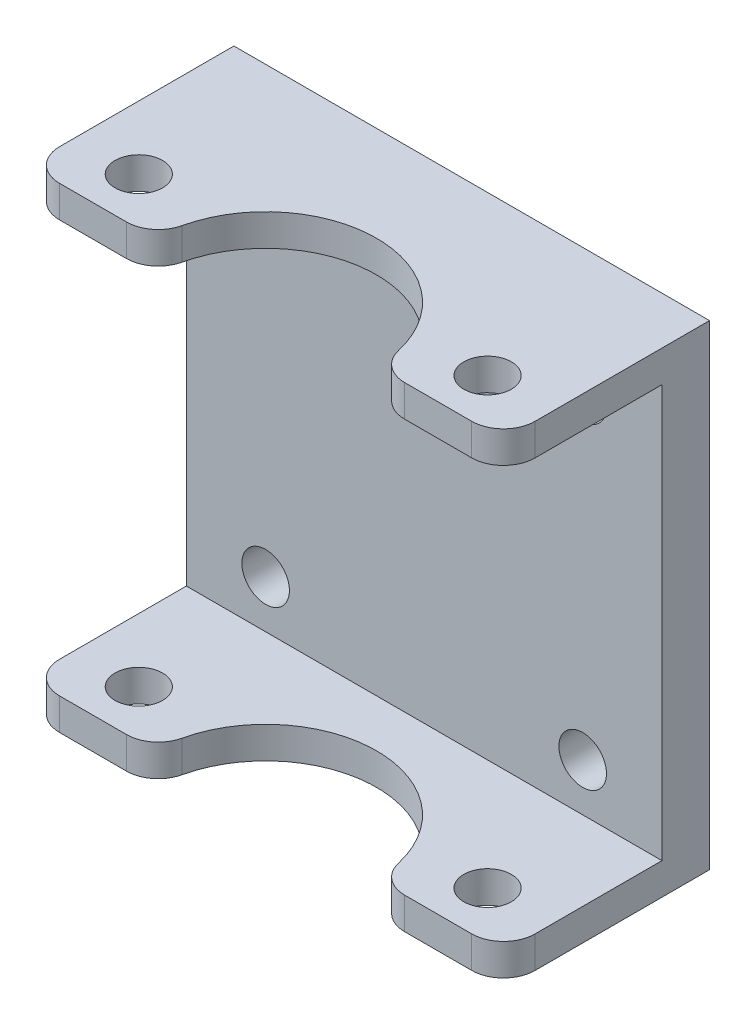
ISO-10303-21;
HEADER;
FILE_DESCRIPTION(('STEP AP214'),'2;1');
FILE_NAME('part.step','',(''),(''),'','','');
FILE_SCHEMA(('AUTOMOTIVE_DESIGN { 1 0 10303 214 1 1 1 1 }'));
ENDSEC;
DATA;
#1=APPLICATION_CONTEXT('core data for automotive mechanical design processes');
#2=APPLICATION_PROTOCOL_DEFINITION('international standard','automotive_design',2000,#1);
#3=PRODUCT_CONTEXT('',#1,'mechanical');
#4=PRODUCT('Part','Part','',(#3));
#5=PRODUCT_RELATED_PRODUCT_CATEGORY('part','',(#4));
#6=PRODUCT_DEFINITION_FORMATION('','',#4);
#7=PRODUCT_DEFINITION_CONTEXT('part definition',#1,'design');
#8=PRODUCT_DEFINITION('design','',#6,#7);
#9=PRODUCT_DEFINITION_SHAPE('','',#8);
#10=(LENGTH_UNIT() NAMED_UNIT(*) SI_UNIT(.MILLI.,.METRE.));
#11=(NAMED_UNIT(*) PLANE_ANGLE_UNIT() SI_UNIT($,.RADIAN.));
#12=(NAMED_UNIT(*) SI_UNIT($,.STERADIAN.) SOLID_ANGLE_UNIT());
#13=UNCERTAINTY_MEASURE_WITH_UNIT(LENGTH_MEASURE(1.E-05),#10,'distance_accuracy_value','');
#14=(GEOMETRIC_REPRESENTATION_CONTEXT(3) GLOBAL_UNCERTAINTY_ASSIGNED_CONTEXT((#13)) GLOBAL_UNIT_ASSIGNED_CONTEXT((#10,
#11,#12)) REPRESENTATION_CONTEXT('',''));
#15=CARTESIAN_POINT('',(0.,0.,0.));
#16=DIRECTION('',(0.,0.,1.));
#17=DIRECTION('',(1.,0.,0.));
#18=AXIS2_PLACEMENT_3D('',#15,#16,#17);
#19=CARTESIAN_POINT('',(0.,0.,3.));
#20=DIRECTION('',(0.,0.,1.));
#21=DIRECTION('',(1.,0.,0.));
#22=AXIS2_PLACEMENT_3D('',#19,#20,#21);
#23=PLANE('',#22);
#24=CARTESIAN_POINT('',(-10.,-9.99999999999999,3.));
#25=DIRECTION('',(0.,0.,1.));
#26=DIRECTION('',(1.,0.,0.));
#27=AXIS2_PLACEMENT_3D('',#24,#25,#26);
#28=CIRCLE('',#27,1.5);
#29=CARTESIAN_POINT('',(-8.5,-9.99999999999999,3.));
#30=VERTEX_POINT('',#29);
#31=EDGE_CURVE('E227',#30,#30,#28,.T.);
#32=ORIENTED_EDGE('',*,*,#31,.F.);
#33=EDGE_LOOP('',(#32));
#34=FACE_BOUND('',#33,.T.);
#35=CARTESIAN_POINT('',(-10.,10.,3.));
#36=DIRECTION('',(0.,0.,1.));
#37=DIRECTION('',(1.,0.,0.));
#38=AXIS2_PLACEMENT_3D('',#35,#36,#37);
#39=CIRCLE('',#38,1.5);
#40=CARTESIAN_POINT('',(-8.5,10.,3.));
#41=VERTEX_POINT('',#40);
#42=EDGE_CURVE('E243',#41,#41,#39,.T.);
#43=ORIENTED_EDGE('',*,*,#42,.F.);
#44=EDGE_LOOP('',(#43));
#45=FACE_BOUND('',#44,.T.);
#46=CARTESIAN_POINT('',(9.99999999999999,10.,3.));
#47=DIRECTION('',(0.,0.,1.));
#48=DIRECTION('',(1.,0.,0.));
#49=AXIS2_PLACEMENT_3D('',#46,#47,#48);
#50=CIRCLE('',#49,1.5);
#51=CARTESIAN_POINT('',(11.5,10.,3.));
#52=VERTEX_POINT('',#51);
#53=EDGE_CURVE('E235',#52,#52,#50,.T.);
#54=ORIENTED_EDGE('',*,*,#53,.F.);
#55=EDGE_LOOP('',(#54));
#56=FACE_BOUND('',#55,.T.);
#57=CARTESIAN_POINT('',(10.,-9.99999999999999,3.));
#58=DIRECTION('',(0.,0.,1.));
#59=DIRECTION('',(1.,0.,0.));
#60=AXIS2_PLACEMENT_3D('',#57,#58,#59);
#61=CIRCLE('',#60,1.5);
#62=CARTESIAN_POINT('',(11.5,-9.99999999999999,3.));
#63=VERTEX_POINT('',#62);
#64=EDGE_CURVE('E219',#63,#63,#61,.T.);
#65=ORIENTED_EDGE('',*,*,#64,.F.);
#66=EDGE_LOOP('',(#65));
#67=FACE_BOUND('',#66,.T.);
#68=DIRECTION('',(0.,-1.,0.));
#69=VECTOR('',#68,1.);
#70=CARTESIAN_POINT('',(-15.,15.,3.));
#71=LINE('',#70,#69);
#72=CARTESIAN_POINT('',(-15.,13.,3.));
#73=VERTEX_POINT('',#72);
#74=CARTESIAN_POINT('',(-15.,-13.,3.));
#75=VERTEX_POINT('',#74);
#76=EDGE_CURVE('E203',#73,#75,#71,.T.);
#77=ORIENTED_EDGE('',*,*,#76,.T.);
#78=DIRECTION('',(-1.,0.,0.));
#79=VECTOR('',#78,1.);
#80=CARTESIAN_POINT('',(-15.,-13.,3.));
#81=LINE('',#80,#79);
#82=CARTESIAN_POINT('',(15.,-13.,3.));
#83=VERTEX_POINT('',#82);
#84=EDGE_CURVE('E201',#83,#75,#81,.T.);
#85=ORIENTED_EDGE('',*,*,#84,.F.);
#86=DIRECTION('',(0.,1.,0.));
#87=VECTOR('',#86,1.);
#88=CARTESIAN_POINT('',(15.,15.,3.));
#89=LINE('',#88,#87);
#90=CARTESIAN_POINT('',(15.,13.,3.));
#91=VERTEX_POINT('',#90);
#92=EDGE_CURVE('E185',#83,#91,#89,.T.);
#93=ORIENTED_EDGE('',*,*,#92,.T.);
#94=DIRECTION('',(1.,0.,0.));
#95=VECTOR('',#94,1.);
#96=CARTESIAN_POINT('',(-15.,13.,3.));
#97=LINE('',#96,#95);
#98=EDGE_CURVE('E193',#73,#91,#97,.T.);
#99=ORIENTED_EDGE('',*,*,#98,.F.);
#100=EDGE_LOOP('',(#77,#85,#93,#99));
#101=FACE_BOUND('',#100,.T.);
#102=ADVANCED_FACE('F41',(#34,#45,#56,#67,#101),#23,.T.);
#103=CARTESIAN_POINT('',(0.,0.,0.));
#104=DIRECTION('',(0.,0.,1.));
#105=DIRECTION('',(1.,0.,0.));
#106=AXIS2_PLACEMENT_3D('',#103,#104,#105);
#107=PLANE('',#106);
#108=DIRECTION('',(0.,1.,0.));
#109=VECTOR('',#108,1.);
#110=CARTESIAN_POINT('',(15.,15.,0.));
#111=LINE('',#110,#109);
#112=CARTESIAN_POINT('',(15.,-15.,0.));
#113=VERTEX_POINT('',#112);
#114=CARTESIAN_POINT('',(15.,15.,0.));
#115=VERTEX_POINT('',#114);
#116=EDGE_CURVE('E247',#113,#115,#111,.T.);
#117=ORIENTED_EDGE('',*,*,#116,.F.);
#118=DIRECTION('',(1.,0.,0.));
#119=VECTOR('',#118,1.);
#120=CARTESIAN_POINT('',(-15.,-15.,0.));
#121=LINE('',#120,#119);
#122=CARTESIAN_POINT('',(-15.,-15.,0.));
#123=VERTEX_POINT('',#122);
#124=EDGE_CURVE('E204',#123,#113,#121,.T.);
#125=ORIENTED_EDGE('',*,*,#124,.F.);
#126=DIRECTION('',(0.,-1.,0.));
#127=VECTOR('',#126,1.);
#128=CARTESIAN_POINT('',(-15.,15.,0.));
#129=LINE('',#128,#127);
#130=CARTESIAN_POINT('',(-15.,15.,0.));
#131=VERTEX_POINT('',#130);
#132=EDGE_CURVE('E261',#131,#123,#129,.T.);
#133=ORIENTED_EDGE('',*,*,#132,.F.);
#134=DIRECTION('',(-1.,0.,0.));
#135=VECTOR('',#134,1.);
#136=CARTESIAN_POINT('',(-15.,15.,0.));
#137=LINE('',#136,#135);
#138=EDGE_CURVE('E257',#115,#131,#137,.T.);
#139=ORIENTED_EDGE('',*,*,#138,.F.);
#140=EDGE_LOOP('',(#117,#125,#133,#139));
#141=FACE_BOUND('',#140,.T.);
#142=CARTESIAN_POINT('',(-10.,10.,0.));
#143=DIRECTION('',(0.,0.,1.));
#144=DIRECTION('',(1.,0.,0.));
#145=AXIS2_PLACEMENT_3D('',#142,#143,#144);
#146=CIRCLE('',#145,1.5);
#147=CARTESIAN_POINT('',(-8.5,10.,0.));
#148=VERTEX_POINT('',#147);
#149=EDGE_CURVE('E239',#148,#148,#146,.T.);
#150=ORIENTED_EDGE('',*,*,#149,.T.);
#151=EDGE_LOOP('',(#150));
#152=FACE_BOUND('',#151,.T.);
#153=CARTESIAN_POINT('',(9.99999999999999,10.,0.));
#154=DIRECTION('',(0.,0.,1.));
#155=DIRECTION('',(1.,0.,0.));
#156=AXIS2_PLACEMENT_3D('',#153,#154,#155);
#157=CIRCLE('',#156,1.5);
#158=CARTESIAN_POINT('',(11.5,10.,0.));
#159=VERTEX_POINT('',#158);
#160=EDGE_CURVE('E231',#159,#159,#157,.T.);
#161=ORIENTED_EDGE('',*,*,#160,.T.);
#162=EDGE_LOOP('',(#161));
#163=FACE_BOUND('',#162,.T.);
#164=CARTESIAN_POINT('',(-10.,-9.99999999999999,0.));
#165=DIRECTION('',(0.,0.,1.));
#166=DIRECTION('',(1.,0.,0.));
#167=AXIS2_PLACEMENT_3D('',#164,#165,#166);
#168=CIRCLE('',#167,1.5);
#169=CARTESIAN_POINT('',(-8.5,-9.99999999999999,0.));
#170=VERTEX_POINT('',#169);
#171=EDGE_CURVE('E223',#170,#170,#168,.T.);
#172=ORIENTED_EDGE('',*,*,#171,.T.);
#173=EDGE_LOOP('',(#172));
#174=FACE_BOUND('',#173,.T.);
#175=CARTESIAN_POINT('',(10.,-9.99999999999999,0.));
#176=DIRECTION('',(0.,0.,1.));
#177=DIRECTION('',(1.,0.,0.));
#178=AXIS2_PLACEMENT_3D('',#175,#176,#177);
#179=CIRCLE('',#178,1.5);
#180=CARTESIAN_POINT('',(11.5,-9.99999999999999,0.));
#181=VERTEX_POINT('',#180);
#182=EDGE_CURVE('E218',#181,#181,#179,.T.);
#183=ORIENTED_EDGE('',*,*,#182,.T.);
#184=EDGE_LOOP('',(#183));
#185=FACE_BOUND('',#184,.T.);
#186=ADVANCED_FACE('F492',(#141,#152,#163,#174,#185),#107,.F.);
#187=CARTESIAN_POINT('',(15.,15.,3.));
#188=DIRECTION('',(-1.,0.,0.));
#189=DIRECTION('',(0.,-1.,0.));
#190=AXIS2_PLACEMENT_3D('',#187,#188,#189);
#191=PLANE('',#190);
#192=DIRECTION('',(0.,0.,-1.));
#193=VECTOR('',#192,1.);
#194=CARTESIAN_POINT('',(15.,-13.,21.));
#195=LINE('',#194,#193);
#196=CARTESIAN_POINT('',(15.,-13.,11.));
#197=VERTEX_POINT('',#196);
#198=EDGE_CURVE('E209',#197,#83,#195,.T.);
#199=ORIENTED_EDGE('',*,*,#198,.F.);
#200=DIRECTION('',(0.,-1.,0.));
#201=VECTOR('',#200,1.);
#202=CARTESIAN_POINT('',(15.,15.,11.));
#203=LINE('',#202,#201);
#204=CARTESIAN_POINT('',(15.,-15.,11.));
#205=VERTEX_POINT('',#204);
#206=EDGE_CURVE('E342',#197,#205,#203,.T.);
#207=ORIENTED_EDGE('',*,*,#206,.T.);
#208=DIRECTION('',(0.,0.,-1.));
#209=VECTOR('',#208,1.);
#210=CARTESIAN_POINT('',(15.,-15.,3.));
#211=LINE('',#210,#209);
#212=EDGE_CURVE('E253',#205,#113,#211,.T.);
#213=ORIENTED_EDGE('',*,*,#212,.T.);
#214=ORIENTED_EDGE('',*,*,#116,.T.);
#215=DIRECTION('',(0.,0.,-1.));
#216=VECTOR('',#215,1.);
#217=CARTESIAN_POINT('',(15.,15.,3.));
#218=LINE('',#217,#216);
#219=CARTESIAN_POINT('',(15.,15.,11.));
#220=VERTEX_POINT('',#219);
#221=EDGE_CURVE('E276',#220,#115,#218,.T.);
#222=ORIENTED_EDGE('',*,*,#221,.F.);
#223=DIRECTION('',(0.,-1.,0.));
#224=VECTOR('',#223,1.);
#225=CARTESIAN_POINT('',(15.,15.,11.));
#226=LINE('',#225,#224);
#227=CARTESIAN_POINT('',(15.,13.,11.));
#228=VERTEX_POINT('',#227);
#229=EDGE_CURVE('E188',#220,#228,#226,.T.);
#230=ORIENTED_EDGE('',*,*,#229,.T.);
#231=DIRECTION('',(0.,0.,-1.));
#232=VECTOR('',#231,1.);
#233=CARTESIAN_POINT('',(15.,13.,21.));
#234=LINE('',#233,#232);
#235=EDGE_CURVE('E181',#228,#91,#234,.T.);
#236=ORIENTED_EDGE('',*,*,#235,.T.);
#237=ORIENTED_EDGE('',*,*,#92,.F.);
#238=EDGE_LOOP('',(#199,#207,#213,#214,#222,#230,#236,#237));
#239=FACE_BOUND('',#238,.T.);
#240=ADVANCED_FACE('F184',(#239),#191,.F.);
#241=CARTESIAN_POINT('',(-15.,15.,3.));
#242=DIRECTION('',(0.,-1.,0.));
#243=DIRECTION('',(0.,0.,-1.));
#244=AXIS2_PLACEMENT_3D('',#241,#242,#243);
#245=PLANE('',#244);
#246=CARTESIAN_POINT('',(-11.,15.,10.));
#247=DIRECTION('',(0.,-1.,0.));
#248=DIRECTION('',(1.,0.,0.));
#249=AXIS2_PLACEMENT_3D('',#246,#247,#248);
#250=CIRCLE('',#249,1.5);
#251=CARTESIAN_POINT('',(-9.5,15.,10.));
#252=VERTEX_POINT('',#251);
#253=EDGE_CURVE('E285',#252,#252,#250,.T.);
#254=ORIENTED_EDGE('',*,*,#253,.T.);
#255=EDGE_LOOP('',(#254));
#256=FACE_BOUND('',#255,.T.);
#257=CARTESIAN_POINT('',(11.,15.,10.));
#258=DIRECTION('',(0.,-1.,0.));
#259=DIRECTION('',(-1.,0.,0.));
#260=AXIS2_PLACEMENT_3D('',#257,#258,#259);
#261=CIRCLE('',#260,1.5);
#262=CARTESIAN_POINT('',(9.5,15.,10.));
#263=VERTEX_POINT('',#262);
#264=EDGE_CURVE('E431',#263,#263,#261,.T.);
#265=ORIENTED_EDGE('',*,*,#264,.T.);
#266=EDGE_LOOP('',(#265));
#267=FACE_BOUND('',#266,.T.);
#268=DIRECTION('',(1.,0.,0.));
#269=VECTOR('',#268,1.);
#270=CARTESIAN_POINT('',(16.365937277099,15.,13.));
#271=LINE('',#270,#269);
#272=CARTESIAN_POINT('',(8.77496438739212,15.,13.));
#273=VERTEX_POINT('',#272);
#274=CARTESIAN_POINT('',(13.,15.,13.));
#275=VERTEX_POINT('',#274);
#276=EDGE_CURVE('E468',#273,#275,#271,.T.);
#277=ORIENTED_EDGE('',*,*,#276,.T.);
#278=CARTESIAN_POINT('',(13.,15.,11.));
#279=DIRECTION('',(0.,-1.,0.));
#280=DIRECTION('',(0.,0.,-1.));
#281=AXIS2_PLACEMENT_3D('',#278,#279,#280);
#282=CIRCLE('',#281,2.);
#283=EDGE_CURVE('E373',#275,#220,#282,.F.);
#284=ORIENTED_EDGE('',*,*,#283,.T.);
#285=ORIENTED_EDGE('',*,*,#221,.T.);
#286=ORIENTED_EDGE('',*,*,#138,.T.);
#287=DIRECTION('',(0.,0.,-1.));
#288=VECTOR('',#287,1.);
#289=CARTESIAN_POINT('',(-15.,15.,3.));
#290=LINE('',#289,#288);
#291=CARTESIAN_POINT('',(-15.,15.,11.));
#292=VERTEX_POINT('',#291);
#293=EDGE_CURVE('E273',#292,#131,#290,.T.);
#294=ORIENTED_EDGE('',*,*,#293,.F.);
#295=CARTESIAN_POINT('',(-13.,15.,11.));
#296=DIRECTION('',(0.,-1.,0.));
#297=DIRECTION('',(0.,0.,-1.));
#298=AXIS2_PLACEMENT_3D('',#295,#296,#297);
#299=CIRCLE('',#298,2.);
#300=CARTESIAN_POINT('',(-13.,15.,13.));
#301=VERTEX_POINT('',#300);
#302=EDGE_CURVE('E365',#292,#301,#299,.F.);
#303=ORIENTED_EDGE('',*,*,#302,.T.);
#304=DIRECTION('',(1.,0.,0.));
#305=VECTOR('',#304,1.);
#306=CARTESIAN_POINT('',(-7.,15.,13.));
#307=LINE('',#306,#305);
#308=CARTESIAN_POINT('',(-8.77496438739212,15.,13.));
#309=VERTEX_POINT('',#308);
#310=EDGE_CURVE('E457',#301,#309,#307,.T.);
#311=ORIENTED_EDGE('',*,*,#310,.T.);
#312=CARTESIAN_POINT('',(-8.77496438739212,15.,11.));
#313=DIRECTION('',(0.,-1.,0.));
#314=DIRECTION('',(0.,0.,-1.));
#315=AXIS2_PLACEMENT_3D('',#312,#313,#314);
#316=CIRCLE('',#315,2.);
#317=CARTESIAN_POINT('',(-6.82497230130498,15.,11.4444444444444));
#318=VERTEX_POINT('',#317);
#319=EDGE_CURVE('E64',#309,#318,#316,.F.);
#320=ORIENTED_EDGE('',*,*,#319,.T.);
#321=CARTESIAN_POINT('',(0.,15.,13.));
#322=DIRECTION('',(0.,-1.,0.));
#323=DIRECTION('',(0.,0.,-1.));
#324=AXIS2_PLACEMENT_3D('',#321,#322,#323);
#325=CIRCLE('',#324,7.);
#326=CARTESIAN_POINT('',(6.82497230130498,15.,11.4444444444444));
#327=VERTEX_POINT('',#326);
#328=EDGE_CURVE('E412',#318,#327,#325,.T.);
#329=ORIENTED_EDGE('',*,*,#328,.T.);
#330=CARTESIAN_POINT('',(8.77496438739212,15.,11.));
#331=DIRECTION('',(0.,-1.,0.));
#332=DIRECTION('',(0.,0.,-1.));
#333=AXIS2_PLACEMENT_3D('',#330,#331,#332);
#334=CIRCLE('',#333,2.);
#335=EDGE_CURVE('E370',#327,#273,#334,.F.);
#336=ORIENTED_EDGE('',*,*,#335,.T.);
#337=EDGE_LOOP('',(#277,#284,#285,#286,#294,#303,#311,#320,#329,#336));
#338=FACE_BOUND('',#337,.T.);
#339=ADVANCED_FACE('F474',(#256,#267,#338),#245,.F.);
#340=CARTESIAN_POINT('',(-15.,15.,3.));
#341=DIRECTION('',(1.,0.,0.));
#342=DIRECTION('',(0.,1.,0.));
#343=AXIS2_PLACEMENT_3D('',#340,#341,#342);
#344=PLANE('',#343);
#345=DIRECTION('',(0.,0.,-1.));
#346=VECTOR('',#345,1.);
#347=CARTESIAN_POINT('',(-15.,13.,21.));
#348=LINE('',#347,#346);
#349=CARTESIAN_POINT('',(-15.,13.,11.));
#350=VERTEX_POINT('',#349);
#351=EDGE_CURVE('E192',#350,#73,#348,.T.);
#352=ORIENTED_EDGE('',*,*,#351,.F.);
#353=DIRECTION('',(0.,1.,0.));
#354=VECTOR('',#353,1.);
#355=CARTESIAN_POINT('',(-15.,15.,11.));
#356=LINE('',#355,#354);
#357=EDGE_CURVE('E392',#350,#292,#356,.T.);
#358=ORIENTED_EDGE('',*,*,#357,.T.);
#359=ORIENTED_EDGE('',*,*,#293,.T.);
#360=ORIENTED_EDGE('',*,*,#132,.T.);
#361=DIRECTION('',(0.,0.,-1.));
#362=VECTOR('',#361,1.);
#363=CARTESIAN_POINT('',(-15.,-15.,3.));
#364=LINE('',#363,#362);
#365=CARTESIAN_POINT('',(-15.,-15.,11.));
#366=VERTEX_POINT('',#365);
#367=EDGE_CURVE('E270',#366,#123,#364,.T.);
#368=ORIENTED_EDGE('',*,*,#367,.F.);
#369=DIRECTION('',(0.,1.,0.));
#370=VECTOR('',#369,1.);
#371=CARTESIAN_POINT('',(-15.,15.,11.));
#372=LINE('',#371,#370);
#373=CARTESIAN_POINT('',(-15.,-13.,11.));
#374=VERTEX_POINT('',#373);
#375=EDGE_CURVE('E388',#366,#374,#372,.T.);
#376=ORIENTED_EDGE('',*,*,#375,.T.);
#377=DIRECTION('',(0.,0.,-1.));
#378=VECTOR('',#377,1.);
#379=CARTESIAN_POINT('',(-15.,-13.,21.));
#380=LINE('',#379,#378);
#381=EDGE_CURVE('E212',#374,#75,#380,.T.);
#382=ORIENTED_EDGE('',*,*,#381,.T.);
#383=ORIENTED_EDGE('',*,*,#76,.F.);
#384=EDGE_LOOP('',(#352,#358,#359,#360,#368,#376,#382,#383));
#385=FACE_BOUND('',#384,.T.);
#386=ADVANCED_FACE('F418',(#385),#344,.F.);
#387=CARTESIAN_POINT('',(-15.,-15.,3.));
#388=DIRECTION('',(0.,1.,0.));
#389=DIRECTION('',(0.,0.,1.));
#390=AXIS2_PLACEMENT_3D('',#387,#388,#389);
#391=PLANE('',#390);
#392=CARTESIAN_POINT('',(-11.,-15.,10.));
#393=DIRECTION('',(0.,-1.,0.));
#394=DIRECTION('',(1.,0.,0.));
#395=AXIS2_PLACEMENT_3D('',#392,#393,#394);
#396=CIRCLE('',#395,1.5);
#397=CARTESIAN_POINT('',(-9.5,-15.,10.));
#398=VERTEX_POINT('',#397);
#399=EDGE_CURVE('E435',#398,#398,#396,.T.);
#400=ORIENTED_EDGE('',*,*,#399,.F.);
#401=EDGE_LOOP('',(#400));
#402=FACE_BOUND('',#401,.T.);
#403=CARTESIAN_POINT('',(11.,-15.,10.));
#404=DIRECTION('',(0.,-1.,0.));
#405=DIRECTION('',(-1.,0.,0.));
#406=AXIS2_PLACEMENT_3D('',#403,#404,#405);
#407=CIRCLE('',#406,1.5);
#408=CARTESIAN_POINT('',(9.5,-15.,10.));
#409=VERTEX_POINT('',#408);
#410=EDGE_CURVE('E436',#409,#409,#407,.T.);
#411=ORIENTED_EDGE('',*,*,#410,.F.);
#412=EDGE_LOOP('',(#411));
#413=FACE_BOUND('',#412,.T.);
#414=DIRECTION('',(1.,0.,0.));
#415=VECTOR('',#414,1.);
#416=CARTESIAN_POINT('',(16.365937277099,-15.,13.));
#417=LINE('',#416,#415);
#418=CARTESIAN_POINT('',(8.77496438739212,-15.,13.));
#419=VERTEX_POINT('',#418);
#420=CARTESIAN_POINT('',(13.,-15.,13.));
#421=VERTEX_POINT('',#420);
#422=EDGE_CURVE('E413',#419,#421,#417,.T.);
#423=ORIENTED_EDGE('',*,*,#422,.F.);
#424=CARTESIAN_POINT('',(8.77496438739212,-15.,11.));
#425=DIRECTION('',(0.,1.,0.));
#426=DIRECTION('',(0.,0.,1.));
#427=AXIS2_PLACEMENT_3D('',#424,#425,#426);
#428=CIRCLE('',#427,2.);
#429=CARTESIAN_POINT('',(6.82497230130498,-15.,11.4444444444444));
#430=VERTEX_POINT('',#429);
#431=EDGE_CURVE('E318',#419,#430,#428,.F.);
#432=ORIENTED_EDGE('',*,*,#431,.T.);
#433=CARTESIAN_POINT('',(0.,-15.,13.));
#434=DIRECTION('',(0.,-1.,0.));
#435=DIRECTION('',(0.,0.,-1.));
#436=AXIS2_PLACEMENT_3D('',#433,#434,#435);
#437=CIRCLE('',#436,7.);
#438=CARTESIAN_POINT('',(-6.82497230130498,-15.,11.4444444444444));
#439=VERTEX_POINT('',#438);
#440=EDGE_CURVE('E462',#439,#430,#437,.T.);
#441=ORIENTED_EDGE('',*,*,#440,.F.);
#442=CARTESIAN_POINT('',(-8.77496438739212,-15.,11.));
#443=DIRECTION('',(0.,1.,0.));
#444=DIRECTION('',(0.,0.,1.));
#445=AXIS2_PLACEMENT_3D('',#442,#443,#444);
#446=CIRCLE('',#445,2.);
#447=CARTESIAN_POINT('',(-8.77496438739212,-15.,13.));
#448=VERTEX_POINT('',#447);
#449=EDGE_CURVE('E312',#439,#448,#446,.F.);
#450=ORIENTED_EDGE('',*,*,#449,.T.);
#451=DIRECTION('',(1.,0.,0.));
#452=VECTOR('',#451,1.);
#453=CARTESIAN_POINT('',(-7.,-15.,13.));
#454=LINE('',#453,#452);
#455=CARTESIAN_POINT('',(-13.,-15.,13.));
#456=VERTEX_POINT('',#455);
#457=EDGE_CURVE('E402',#456,#448,#454,.T.);
#458=ORIENTED_EDGE('',*,*,#457,.F.);
#459=CARTESIAN_POINT('',(-13.,-15.,11.));
#460=DIRECTION('',(0.,1.,0.));
#461=DIRECTION('',(0.,0.,1.));
#462=AXIS2_PLACEMENT_3D('',#459,#460,#461);
#463=CIRCLE('',#462,2.);
#464=EDGE_CURVE('E309',#456,#366,#463,.F.);
#465=ORIENTED_EDGE('',*,*,#464,.T.);
#466=ORIENTED_EDGE('',*,*,#367,.T.);
#467=ORIENTED_EDGE('',*,*,#124,.T.);
#468=ORIENTED_EDGE('',*,*,#212,.F.);
#469=CARTESIAN_POINT('',(13.,-15.,11.));
#470=DIRECTION('',(0.,1.,0.));
#471=DIRECTION('',(0.,0.,1.));
#472=AXIS2_PLACEMENT_3D('',#469,#470,#471);
#473=CIRCLE('',#472,2.);
#474=EDGE_CURVE('E315',#205,#421,#473,.F.);
#475=ORIENTED_EDGE('',*,*,#474,.T.);
#476=EDGE_LOOP('',(#423,#432,#441,#450,#458,#465,#466,#467,#468,#475));
#477=FACE_BOUND('',#476,.T.);
#478=ADVANCED_FACE('F408',(#402,#413,#477),#391,.F.);
#479=CARTESIAN_POINT('',(-10.,10.,3.));
#480=DIRECTION('',(0.,0.,-1.));
#481=DIRECTION('',(-1.,0.,0.));
#482=AXIS2_PLACEMENT_3D('',#479,#480,#481);
#483=CYLINDRICAL_SURFACE('',#482,1.5);
#484=ORIENTED_EDGE('',*,*,#42,.T.);
#485=EDGE_LOOP('',(#484));
#486=FACE_BOUND('',#485,.T.);
#487=ORIENTED_EDGE('',*,*,#149,.F.);
#488=EDGE_LOOP('',(#487));
#489=FACE_BOUND('',#488,.T.);
#490=ADVANCED_FACE('F530',(#486,#489),#483,.F.);
#491=CARTESIAN_POINT('',(9.99999999999999,10.,3.));
#492=DIRECTION('',(0.,0.,-1.));
#493=DIRECTION('',(-1.,0.,0.));
#494=AXIS2_PLACEMENT_3D('',#491,#492,#493);
#495=CYLINDRICAL_SURFACE('',#494,1.5);
#496=ORIENTED_EDGE('',*,*,#53,.T.);
#497=EDGE_LOOP('',(#496));
#498=FACE_BOUND('',#497,.T.);
#499=ORIENTED_EDGE('',*,*,#160,.F.);
#500=EDGE_LOOP('',(#499));
#501=FACE_BOUND('',#500,.T.);
#502=ADVANCED_FACE('F751',(#498,#501),#495,.F.);
#503=CARTESIAN_POINT('',(-10.,-9.99999999999999,3.));
#504=DIRECTION('',(0.,0.,-1.));
#505=DIRECTION('',(-1.,0.,0.));
#506=AXIS2_PLACEMENT_3D('',#503,#504,#505);
#507=CYLINDRICAL_SURFACE('',#506,1.5);
#508=ORIENTED_EDGE('',*,*,#31,.T.);
#509=EDGE_LOOP('',(#508));
#510=FACE_BOUND('',#509,.T.);
#511=ORIENTED_EDGE('',*,*,#171,.F.);
#512=EDGE_LOOP('',(#511));
#513=FACE_BOUND('',#512,.T.);
#514=ADVANCED_FACE('F760',(#510,#513),#507,.F.);
#515=CARTESIAN_POINT('',(10.,-9.99999999999999,3.));
#516=DIRECTION('',(0.,0.,-1.));
#517=DIRECTION('',(-1.,0.,0.));
#518=AXIS2_PLACEMENT_3D('',#515,#516,#517);
#519=CYLINDRICAL_SURFACE('',#518,1.5);
#520=ORIENTED_EDGE('',*,*,#64,.T.);
#521=EDGE_LOOP('',(#520));
#522=FACE_BOUND('',#521,.T.);
#523=ORIENTED_EDGE('',*,*,#182,.F.);
#524=EDGE_LOOP('',(#523));
#525=FACE_BOUND('',#524,.T.);
#526=ADVANCED_FACE('F705',(#522,#525),#519,.F.);
#527=CARTESIAN_POINT('',(-15.,13.,21.));
#528=DIRECTION('',(0.,1.,0.));
#529=DIRECTION('',(-1.,0.,0.));
#530=AXIS2_PLACEMENT_3D('',#527,#528,#529);
#531=PLANE('',#530);
#532=CARTESIAN_POINT('',(-11.,13.,10.));
#533=DIRECTION('',(0.,1.,0.));
#534=DIRECTION('',(-1.,0.,0.));
#535=AXIS2_PLACEMENT_3D('',#532,#533,#534);
#536=CIRCLE('',#535,1.5);
#537=CARTESIAN_POINT('',(-12.5,13.,10.));
#538=VERTEX_POINT('',#537);
#539=EDGE_CURVE('E290',#538,#538,#536,.T.);
#540=ORIENTED_EDGE('',*,*,#539,.T.);
#541=EDGE_LOOP('',(#540));
#542=FACE_BOUND('',#541,.T.);
#543=CARTESIAN_POINT('',(11.,13.,10.));
#544=DIRECTION('',(0.,1.,0.));
#545=DIRECTION('',(-1.,0.,0.));
#546=AXIS2_PLACEMENT_3D('',#543,#544,#545);
#547=CIRCLE('',#546,1.5);
#548=CARTESIAN_POINT('',(9.5,13.,10.));
#549=VERTEX_POINT('',#548);
#550=EDGE_CURVE('E284',#549,#549,#547,.T.);
#551=ORIENTED_EDGE('',*,*,#550,.T.);
#552=EDGE_LOOP('',(#551));
#553=FACE_BOUND('',#552,.T.);
#554=ORIENTED_EDGE('',*,*,#235,.F.);
#555=CARTESIAN_POINT('',(13.,13.,11.));
#556=DIRECTION('',(0.,1.,0.));
#557=DIRECTION('',(-1.,0.,0.));
#558=AXIS2_PLACEMENT_3D('',#555,#556,#557);
#559=CIRCLE('',#558,2.);
#560=CARTESIAN_POINT('',(13.,13.,13.));
#561=VERTEX_POINT('',#560);
#562=EDGE_CURVE('E355',#228,#561,#559,.F.);
#563=ORIENTED_EDGE('',*,*,#562,.T.);
#564=DIRECTION('',(-1.,0.,0.));
#565=VECTOR('',#564,1.);
#566=CARTESIAN_POINT('',(-15.,13.,13.));
#567=LINE('',#566,#565);
#568=CARTESIAN_POINT('',(8.77496438739212,13.,13.));
#569=VERTEX_POINT('',#568);
#570=EDGE_CURVE('E454',#561,#569,#567,.T.);
#571=ORIENTED_EDGE('',*,*,#570,.T.);
#572=CARTESIAN_POINT('',(8.77496438739212,13.,11.));
#573=DIRECTION('',(0.,1.,0.));
#574=DIRECTION('',(-1.,0.,0.));
#575=AXIS2_PLACEMENT_3D('',#572,#573,#574);
#576=CIRCLE('',#575,2.);
#577=CARTESIAN_POINT('',(6.82497230130498,13.,11.4444444444444));
#578=VERTEX_POINT('',#577);
#579=EDGE_CURVE('E352',#569,#578,#576,.F.);
#580=ORIENTED_EDGE('',*,*,#579,.T.);
#581=CARTESIAN_POINT('',(0.,13.,13.));
#582=DIRECTION('',(0.,1.,0.));
#583=DIRECTION('',(-1.,0.,0.));
#584=AXIS2_PLACEMENT_3D('',#581,#582,#583);
#585=CIRCLE('',#584,7.);
#586=CARTESIAN_POINT('',(-6.82497230130498,13.,11.4444444444444));
#587=VERTEX_POINT('',#586);
#588=EDGE_CURVE('E440',#578,#587,#585,.T.);
#589=ORIENTED_EDGE('',*,*,#588,.T.);
#590=CARTESIAN_POINT('',(-8.77496438739212,13.,11.));
#591=DIRECTION('',(0.,1.,0.));
#592=DIRECTION('',(-1.,0.,0.));
#593=AXIS2_PLACEMENT_3D('',#590,#591,#592);
#594=CIRCLE('',#593,2.);
#595=CARTESIAN_POINT('',(-8.77496438739212,13.,13.));
#596=VERTEX_POINT('',#595);
#597=EDGE_CURVE('E349',#587,#596,#594,.F.);
#598=ORIENTED_EDGE('',*,*,#597,.T.);
#599=DIRECTION('',(-1.,0.,0.));
#600=VECTOR('',#599,1.);
#601=CARTESIAN_POINT('',(-15.,13.,13.));
#602=LINE('',#601,#600);
#603=CARTESIAN_POINT('',(-13.,13.,13.));
#604=VERTEX_POINT('',#603);
#605=EDGE_CURVE('E450',#596,#604,#602,.T.);
#606=ORIENTED_EDGE('',*,*,#605,.T.);
#607=CARTESIAN_POINT('',(-13.,13.,11.));
#608=DIRECTION('',(0.,1.,0.));
#609=DIRECTION('',(-1.,0.,0.));
#610=AXIS2_PLACEMENT_3D('',#607,#608,#609);
#611=CIRCLE('',#610,2.);
#612=EDGE_CURVE('E346',#604,#350,#611,.F.);
#613=ORIENTED_EDGE('',*,*,#612,.T.);
#614=ORIENTED_EDGE('',*,*,#351,.T.);
#615=ORIENTED_EDGE('',*,*,#98,.T.);
#616=EDGE_LOOP('',(#554,#563,#571,#580,#589,#598,#606,#613,#614,#615));
#617=FACE_BOUND('',#616,.T.);
#618=ADVANCED_FACE('F206',(#542,#553,#617),#531,.F.);
#619=CARTESIAN_POINT('',(-15.,-13.,21.));
#620=DIRECTION('',(0.,-1.,0.));
#621=DIRECTION('',(0.,0.,-1.));
#622=AXIS2_PLACEMENT_3D('',#619,#620,#621);
#623=PLANE('',#622);
#624=CARTESIAN_POINT('',(-11.,-13.,10.));
#625=DIRECTION('',(0.,-1.,0.));
#626=DIRECTION('',(0.,0.,-1.));
#627=AXIS2_PLACEMENT_3D('',#624,#625,#626);
#628=CIRCLE('',#627,1.5);
#629=CARTESIAN_POINT('',(-11.,-13.,8.5));
#630=VERTEX_POINT('',#629);
#631=EDGE_CURVE('E286',#630,#630,#628,.T.);
#632=ORIENTED_EDGE('',*,*,#631,.T.);
#633=EDGE_LOOP('',(#632));
#634=FACE_BOUND('',#633,.T.);
#635=CARTESIAN_POINT('',(11.,-13.,10.));
#636=DIRECTION('',(0.,-1.,0.));
#637=DIRECTION('',(0.,0.,-1.));
#638=AXIS2_PLACEMENT_3D('',#635,#636,#637);
#639=CIRCLE('',#638,1.5);
#640=CARTESIAN_POINT('',(11.,-13.,8.5));
#641=VERTEX_POINT('',#640);
#642=EDGE_CURVE('E280',#641,#641,#639,.T.);
#643=ORIENTED_EDGE('',*,*,#642,.T.);
#644=EDGE_LOOP('',(#643));
#645=FACE_BOUND('',#644,.T.);
#646=CARTESIAN_POINT('',(0.,-13.,13.));
#647=DIRECTION('',(0.,-1.,0.));
#648=DIRECTION('',(0.,0.,-1.));
#649=AXIS2_PLACEMENT_3D('',#646,#647,#648);
#650=CIRCLE('',#649,7.);
#651=CARTESIAN_POINT('',(-6.82497230130498,-13.,11.4444444444444));
#652=VERTEX_POINT('',#651);
#653=CARTESIAN_POINT('',(6.82497230130498,-13.,11.4444444444444));
#654=VERTEX_POINT('',#653);
#655=EDGE_CURVE('E294',#652,#654,#650,.T.);
#656=ORIENTED_EDGE('',*,*,#655,.T.);
#657=CARTESIAN_POINT('',(8.77496438739212,-13.,11.));
#658=DIRECTION('',(0.,-1.,0.));
#659=DIRECTION('',(0.,0.,-1.));
#660=AXIS2_PLACEMENT_3D('',#657,#658,#659);
#661=CIRCLE('',#660,2.);
#662=CARTESIAN_POINT('',(8.77496438739212,-13.,13.));
#663=VERTEX_POINT('',#662);
#664=EDGE_CURVE('E337',#654,#663,#661,.F.);
#665=ORIENTED_EDGE('',*,*,#664,.T.);
#666=DIRECTION('',(1.,0.,0.));
#667=VECTOR('',#666,1.);
#668=CARTESIAN_POINT('',(-15.,-13.,13.));
#669=LINE('',#668,#667);
#670=CARTESIAN_POINT('',(13.,-13.,13.));
#671=VERTEX_POINT('',#670);
#672=EDGE_CURVE('E279',#663,#671,#669,.T.);
#673=ORIENTED_EDGE('',*,*,#672,.T.);
#674=CARTESIAN_POINT('',(13.,-13.,11.));
#675=DIRECTION('',(0.,-1.,0.));
#676=DIRECTION('',(0.,0.,-1.));
#677=AXIS2_PLACEMENT_3D('',#674,#675,#676);
#678=CIRCLE('',#677,2.);
#679=EDGE_CURVE('E334',#671,#197,#678,.F.);
#680=ORIENTED_EDGE('',*,*,#679,.T.);
#681=ORIENTED_EDGE('',*,*,#198,.T.);
#682=ORIENTED_EDGE('',*,*,#84,.T.);
#683=ORIENTED_EDGE('',*,*,#381,.F.);
#684=CARTESIAN_POINT('',(-13.,-13.,11.));
#685=DIRECTION('',(0.,-1.,0.));
#686=DIRECTION('',(0.,0.,-1.));
#687=AXIS2_PLACEMENT_3D('',#684,#685,#686);
#688=CIRCLE('',#687,2.);
#689=CARTESIAN_POINT('',(-13.,-13.,13.));
#690=VERTEX_POINT('',#689);
#691=EDGE_CURVE('E328',#374,#690,#688,.F.);
#692=ORIENTED_EDGE('',*,*,#691,.T.);
#693=DIRECTION('',(1.,0.,0.));
#694=VECTOR('',#693,1.);
#695=CARTESIAN_POINT('',(-15.,-13.,13.));
#696=LINE('',#695,#694);
#697=CARTESIAN_POINT('',(-8.77496438739212,-13.,13.));
#698=VERTEX_POINT('',#697);
#699=EDGE_CURVE('E298',#690,#698,#696,.T.);
#700=ORIENTED_EDGE('',*,*,#699,.T.);
#701=CARTESIAN_POINT('',(-8.77496438739212,-13.,11.));
#702=DIRECTION('',(0.,-1.,0.));
#703=DIRECTION('',(0.,0.,-1.));
#704=AXIS2_PLACEMENT_3D('',#701,#702,#703);
#705=CIRCLE('',#704,2.);
#706=EDGE_CURVE('E331',#698,#652,#705,.F.);
#707=ORIENTED_EDGE('',*,*,#706,.T.);
#708=EDGE_LOOP('',(#656,#665,#673,#680,#681,#682,#683,#692,#700,#707));
#709=FACE_BOUND('',#708,.T.);
#710=ADVANCED_FACE('F420',(#634,#645,#709),#623,.F.);
#711=CARTESIAN_POINT('',(11.,15.,10.));
#712=DIRECTION('',(0.,-1.,0.));
#713=DIRECTION('',(1.,0.,0.));
#714=AXIS2_PLACEMENT_3D('',#711,#712,#713);
#715=CYLINDRICAL_SURFACE('',#714,1.5);
#716=ORIENTED_EDGE('',*,*,#410,.T.);
#717=EDGE_LOOP('',(#716));
#718=FACE_BOUND('',#717,.T.);
#719=ORIENTED_EDGE('',*,*,#642,.F.);
#720=EDGE_LOOP('',(#719));
#721=FACE_BOUND('',#720,.T.);
#722=ADVANCED_FACE('F677',(#718,#721),#715,.F.);
#723=CARTESIAN_POINT('',(-11.,15.,10.));
#724=DIRECTION('',(0.,-1.,0.));
#725=DIRECTION('',(1.,0.,0.));
#726=AXIS2_PLACEMENT_3D('',#723,#724,#725);
#727=CYLINDRICAL_SURFACE('',#726,1.5);
#728=ORIENTED_EDGE('',*,*,#399,.T.);
#729=EDGE_LOOP('',(#728));
#730=FACE_BOUND('',#729,.T.);
#731=ORIENTED_EDGE('',*,*,#631,.F.);
#732=EDGE_LOOP('',(#731));
#733=FACE_BOUND('',#732,.T.);
#734=ADVANCED_FACE('F584',(#730,#733),#727,.F.);
#735=ORIENTED_EDGE('',*,*,#264,.F.);
#736=EDGE_LOOP('',(#735));
#737=FACE_BOUND('',#736,.T.);
#738=ORIENTED_EDGE('',*,*,#550,.F.);
#739=EDGE_LOOP('',(#738));
#740=FACE_BOUND('',#739,.T.);
#741=ADVANCED_FACE('F582',(#737,#740),#715,.F.);
#742=ORIENTED_EDGE('',*,*,#253,.F.);
#743=EDGE_LOOP('',(#742));
#744=FACE_BOUND('',#743,.T.);
#745=ORIENTED_EDGE('',*,*,#539,.F.);
#746=EDGE_LOOP('',(#745));
#747=FACE_BOUND('',#746,.T.);
#748=ADVANCED_FACE('F577',(#744,#747),#727,.F.);
#749=CARTESIAN_POINT('',(16.365937277099,15.,13.));
#750=DIRECTION('',(0.,0.,-1.));
#751=DIRECTION('',(-1.,0.,0.));
#752=AXIS2_PLACEMENT_3D('',#749,#750,#751);
#753=PLANE('',#752);
#754=ORIENTED_EDGE('',*,*,#672,.F.);
#755=DIRECTION('',(0.,-1.,0.));
#756=VECTOR('',#755,1.);
#757=CARTESIAN_POINT('',(8.77496438739212,15.,13.));
#758=LINE('',#757,#756);
#759=EDGE_CURVE('E305',#663,#419,#758,.T.);
#760=ORIENTED_EDGE('',*,*,#759,.T.);
#761=ORIENTED_EDGE('',*,*,#422,.T.);
#762=DIRECTION('',(0.,-1.,0.));
#763=VECTOR('',#762,1.);
#764=CARTESIAN_POINT('',(13.,15.,13.));
#765=LINE('',#764,#763);
#766=EDGE_CURVE('E302',#421,#671,#765,.F.);
#767=ORIENTED_EDGE('',*,*,#766,.T.);
#768=EDGE_LOOP('',(#754,#760,#761,#767));
#769=FACE_BOUND('',#768,.T.);
#770=ADVANCED_FACE('F573',(#769),#753,.F.);
#771=CARTESIAN_POINT('',(-7.,15.,13.));
#772=DIRECTION('',(0.,0.,-1.));
#773=DIRECTION('',(-1.,0.,0.));
#774=AXIS2_PLACEMENT_3D('',#771,#772,#773);
#775=PLANE('',#774);
#776=ORIENTED_EDGE('',*,*,#457,.T.);
#777=DIRECTION('',(0.,-1.,0.));
#778=VECTOR('',#777,1.);
#779=CARTESIAN_POINT('',(-8.77496438739212,15.,13.));
#780=LINE('',#779,#778);
#781=EDGE_CURVE('E11',#448,#698,#780,.F.);
#782=ORIENTED_EDGE('',*,*,#781,.T.);
#783=ORIENTED_EDGE('',*,*,#699,.F.);
#784=DIRECTION('',(0.,1.,0.));
#785=VECTOR('',#784,1.);
#786=CARTESIAN_POINT('',(-13.,15.,13.));
#787=LINE('',#786,#785);
#788=EDGE_CURVE('E50',#690,#456,#787,.F.);
#789=ORIENTED_EDGE('',*,*,#788,.T.);
#790=EDGE_LOOP('',(#776,#782,#783,#789));
#791=FACE_BOUND('',#790,.T.);
#792=ADVANCED_FACE('F401',(#791),#775,.F.);
#793=CARTESIAN_POINT('',(0.,15.,13.));
#794=DIRECTION('',(0.,-1.,0.));
#795=DIRECTION('',(0.,0.,-1.));
#796=AXIS2_PLACEMENT_3D('',#793,#794,#795);
#797=CYLINDRICAL_SURFACE('',#796,7.);
#798=ORIENTED_EDGE('',*,*,#440,.T.);
#799=DIRECTION('',(0.,-1.,0.));
#800=VECTOR('',#799,1.);
#801=CARTESIAN_POINT('',(6.82497230130498,15.,11.4444444444444));
#802=LINE('',#801,#800);
#803=EDGE_CURVE('E325',#430,#654,#802,.F.);
#804=ORIENTED_EDGE('',*,*,#803,.T.);
#805=ORIENTED_EDGE('',*,*,#655,.F.);
#806=DIRECTION('',(0.,-1.,0.));
#807=VECTOR('',#806,1.);
#808=CARTESIAN_POINT('',(-6.82497230130498,15.,11.4444444444444));
#809=LINE('',#808,#807);
#810=EDGE_CURVE('E321',#652,#439,#809,.T.);
#811=ORIENTED_EDGE('',*,*,#810,.T.);
#812=EDGE_LOOP('',(#798,#804,#805,#811));
#813=FACE_BOUND('',#812,.T.);
#814=ADVANCED_FACE('F510',(#813),#797,.F.);
#815=ORIENTED_EDGE('',*,*,#588,.F.);
#816=DIRECTION('',(0.,-1.,0.));
#817=VECTOR('',#816,1.);
#818=CARTESIAN_POINT('',(6.82497230130498,15.,11.4444444444444));
#819=LINE('',#818,#817);
#820=EDGE_CURVE('E57',#578,#327,#819,.F.);
#821=ORIENTED_EDGE('',*,*,#820,.T.);
#822=ORIENTED_EDGE('',*,*,#328,.F.);
#823=DIRECTION('',(0.,-1.,0.));
#824=VECTOR('',#823,1.);
#825=CARTESIAN_POINT('',(-6.82497230130498,15.,11.4444444444444));
#826=LINE('',#825,#824);
#827=EDGE_CURVE('E376',#318,#587,#826,.T.);
#828=ORIENTED_EDGE('',*,*,#827,.T.);
#829=EDGE_LOOP('',(#815,#821,#822,#828));
#830=FACE_BOUND('',#829,.T.);
#831=ADVANCED_FACE('F508',(#830),#797,.F.);
#832=ORIENTED_EDGE('',*,*,#605,.F.);
#833=DIRECTION('',(0.,-1.,0.));
#834=VECTOR('',#833,1.);
#835=CARTESIAN_POINT('',(-8.77496438739212,15.,13.));
#836=LINE('',#835,#834);
#837=EDGE_CURVE('E385',#596,#309,#836,.F.);
#838=ORIENTED_EDGE('',*,*,#837,.T.);
#839=ORIENTED_EDGE('',*,*,#310,.F.);
#840=DIRECTION('',(0.,1.,0.));
#841=VECTOR('',#840,1.);
#842=CARTESIAN_POINT('',(-13.,15.,13.));
#843=LINE('',#842,#841);
#844=EDGE_CURVE('E382',#301,#604,#843,.F.);
#845=ORIENTED_EDGE('',*,*,#844,.T.);
#846=EDGE_LOOP('',(#832,#838,#839,#845));
#847=FACE_BOUND('',#846,.T.);
#848=ADVANCED_FACE('F504',(#847),#775,.F.);
#849=ORIENTED_EDGE('',*,*,#570,.F.);
#850=DIRECTION('',(0.,-1.,0.));
#851=VECTOR('',#850,1.);
#852=CARTESIAN_POINT('',(13.,15.,13.));
#853=LINE('',#852,#851);
#854=EDGE_CURVE('E362',#561,#275,#853,.F.);
#855=ORIENTED_EDGE('',*,*,#854,.T.);
#856=ORIENTED_EDGE('',*,*,#276,.F.);
#857=DIRECTION('',(0.,-1.,0.));
#858=VECTOR('',#857,1.);
#859=CARTESIAN_POINT('',(8.77496438739212,15.,13.));
#860=LINE('',#859,#858);
#861=EDGE_CURVE('E358',#273,#569,#860,.T.);
#862=ORIENTED_EDGE('',*,*,#861,.T.);
#863=EDGE_LOOP('',(#849,#855,#856,#862));
#864=FACE_BOUND('',#863,.T.);
#865=ADVANCED_FACE('F482',(#864),#753,.F.);
#866=CARTESIAN_POINT('',(8.77496438739212,15.,11.));
#867=DIRECTION('',(0.,-1.,0.));
#868=DIRECTION('',(0.,0.,-1.));
#869=AXIS2_PLACEMENT_3D('',#866,#867,#868);
#870=CYLINDRICAL_SURFACE('',#869,2.);
#871=ORIENTED_EDGE('',*,*,#664,.F.);
#872=ORIENTED_EDGE('',*,*,#803,.F.);
#873=ORIENTED_EDGE('',*,*,#431,.F.);
#874=ORIENTED_EDGE('',*,*,#759,.F.);
#875=EDGE_LOOP('',(#871,#872,#873,#874));
#876=FACE_BOUND('',#875,.T.);
#877=ADVANCED_FACE('F543',(#876),#870,.T.);
#878=CARTESIAN_POINT('',(13.,15.,11.));
#879=DIRECTION('',(0.,-1.,0.));
#880=DIRECTION('',(1.,0.,0.));
#881=AXIS2_PLACEMENT_3D('',#878,#879,#880);
#882=CYLINDRICAL_SURFACE('',#881,2.);
#883=ORIENTED_EDGE('',*,*,#679,.F.);
#884=ORIENTED_EDGE('',*,*,#766,.F.);
#885=ORIENTED_EDGE('',*,*,#474,.F.);
#886=ORIENTED_EDGE('',*,*,#206,.F.);
#887=EDGE_LOOP('',(#883,#884,#885,#886));
#888=FACE_BOUND('',#887,.T.);
#889=ADVANCED_FACE('F546',(#888),#882,.T.);
#890=CARTESIAN_POINT('',(13.,15.,11.));
#891=DIRECTION('',(0.,-1.,0.));
#892=DIRECTION('',(1.,0.,0.));
#893=AXIS2_PLACEMENT_3D('',#890,#891,#892);
#894=CYLINDRICAL_SURFACE('',#893,2.);
#895=ORIENTED_EDGE('',*,*,#283,.F.);
#896=ORIENTED_EDGE('',*,*,#854,.F.);
#897=ORIENTED_EDGE('',*,*,#562,.F.);
#898=ORIENTED_EDGE('',*,*,#229,.F.);
#899=EDGE_LOOP('',(#895,#896,#897,#898));
#900=FACE_BOUND('',#899,.T.);
#901=ADVANCED_FACE('F486',(#900),#894,.T.);
#902=CARTESIAN_POINT('',(8.77496438739212,15.,11.));
#903=DIRECTION('',(0.,-1.,0.));
#904=DIRECTION('',(0.,0.,-1.));
#905=AXIS2_PLACEMENT_3D('',#902,#903,#904);
#906=CYLINDRICAL_SURFACE('',#905,2.);
#907=ORIENTED_EDGE('',*,*,#335,.F.);
#908=ORIENTED_EDGE('',*,*,#820,.F.);
#909=ORIENTED_EDGE('',*,*,#579,.F.);
#910=ORIENTED_EDGE('',*,*,#861,.F.);
#911=EDGE_LOOP('',(#907,#908,#909,#910));
#912=FACE_BOUND('',#911,.T.);
#913=ADVANCED_FACE('F479',(#912),#906,.T.);
#914=CARTESIAN_POINT('',(-8.77496438739212,15.,11.));
#915=DIRECTION('',(0.,-1.,0.));
#916=DIRECTION('',(0.,0.,-1.));
#917=AXIS2_PLACEMENT_3D('',#914,#915,#916);
#918=CYLINDRICAL_SURFACE('',#917,2.);
#919=ORIENTED_EDGE('',*,*,#319,.F.);
#920=ORIENTED_EDGE('',*,*,#837,.F.);
#921=ORIENTED_EDGE('',*,*,#597,.F.);
#922=ORIENTED_EDGE('',*,*,#827,.F.);
#923=EDGE_LOOP('',(#919,#920,#921,#922));
#924=FACE_BOUND('',#923,.T.);
#925=ADVANCED_FACE('F507',(#924),#918,.T.);
#926=CARTESIAN_POINT('',(-13.,15.,11.));
#927=DIRECTION('',(0.,1.,0.));
#928=DIRECTION('',(-1.,0.,0.));
#929=AXIS2_PLACEMENT_3D('',#926,#927,#928);
#930=CYLINDRICAL_SURFACE('',#929,2.);
#931=ORIENTED_EDGE('',*,*,#612,.F.);
#932=ORIENTED_EDGE('',*,*,#844,.F.);
#933=ORIENTED_EDGE('',*,*,#302,.F.);
#934=ORIENTED_EDGE('',*,*,#357,.F.);
#935=EDGE_LOOP('',(#931,#932,#933,#934));
#936=FACE_BOUND('',#935,.T.);
#937=ADVANCED_FACE('F500',(#936),#930,.T.);
#938=CARTESIAN_POINT('',(-8.77496438739212,15.,11.));
#939=DIRECTION('',(0.,-1.,0.));
#940=DIRECTION('',(0.,0.,-1.));
#941=AXIS2_PLACEMENT_3D('',#938,#939,#940);
#942=CYLINDRICAL_SURFACE('',#941,2.);
#943=ORIENTED_EDGE('',*,*,#706,.F.);
#944=ORIENTED_EDGE('',*,*,#781,.F.);
#945=ORIENTED_EDGE('',*,*,#449,.F.);
#946=ORIENTED_EDGE('',*,*,#810,.F.);
#947=EDGE_LOOP('',(#943,#944,#945,#946));
#948=FACE_BOUND('',#947,.T.);
#949=ADVANCED_FACE('F558',(#948),#942,.T.);
#950=CARTESIAN_POINT('',(-13.,15.,11.));
#951=DIRECTION('',(0.,1.,0.));
#952=DIRECTION('',(-1.,0.,0.));
#953=AXIS2_PLACEMENT_3D('',#950,#951,#952);
#954=CYLINDRICAL_SURFACE('',#953,2.);
#955=ORIENTED_EDGE('',*,*,#464,.F.);
#956=ORIENTED_EDGE('',*,*,#788,.F.);
#957=ORIENTED_EDGE('',*,*,#691,.F.);
#958=ORIENTED_EDGE('',*,*,#375,.F.);
#959=EDGE_LOOP('',(#955,#956,#957,#958));
#960=FACE_BOUND('',#959,.T.);
#961=ADVANCED_FACE('F43',(#960),#954,.T.);
#962=CLOSED_SHELL('',(#102,#186,#240,#339,#386,#478,#490,#502,#514,#526,#618,#710,#722,#734,
#741,#748,#770,#792,#814,#831,#848,#865,#877,#889,#901,#913,#925,#937,#949,#961));
#963=MANIFOLD_SOLID_BREP('B2',#962);
#964=ADVANCED_BREP_SHAPE_REPRESENTATION('',(#18,#963),#14);
#965=SHAPE_DEFINITION_REPRESENTATION(#9,#964);
ENDSEC;
END-ISO-10303-21;
